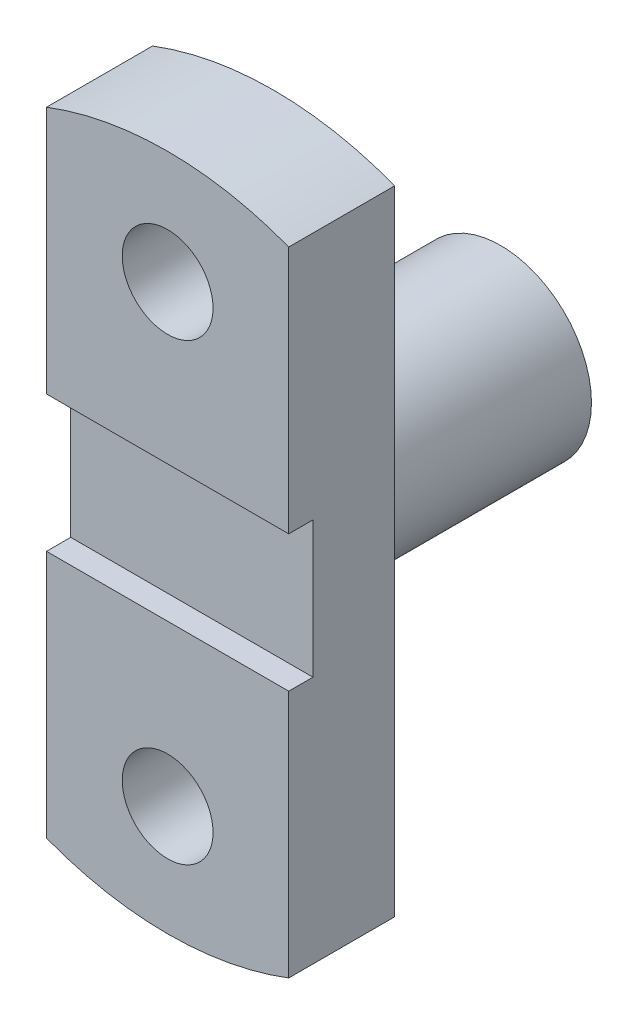
ISO-10303-21;
HEADER;
FILE_DESCRIPTION(('STEP AP214'),'2;1');
FILE_NAME('part.step','',(''),(''),'','','');
FILE_SCHEMA(('AUTOMOTIVE_DESIGN { 1 0 10303 214 1 1 1 1 }'));
ENDSEC;
DATA;
#1=APPLICATION_CONTEXT('core data for automotive mechanical design processes');
#2=APPLICATION_PROTOCOL_DEFINITION('international standard','automotive_design',2000,#1);
#3=PRODUCT_CONTEXT('',#1,'mechanical');
#4=PRODUCT('Part','Part','',(#3));
#5=PRODUCT_RELATED_PRODUCT_CATEGORY('part','',(#4));
#6=PRODUCT_DEFINITION_FORMATION('','',#4);
#7=PRODUCT_DEFINITION_CONTEXT('part definition',#1,'design');
#8=PRODUCT_DEFINITION('design','',#6,#7);
#9=PRODUCT_DEFINITION_SHAPE('','',#8);
#10=(LENGTH_UNIT() NAMED_UNIT(*) SI_UNIT(.MILLI.,.METRE.));
#11=(NAMED_UNIT(*) PLANE_ANGLE_UNIT() SI_UNIT($,.RADIAN.));
#12=(NAMED_UNIT(*) SI_UNIT($,.STERADIAN.) SOLID_ANGLE_UNIT());
#13=UNCERTAINTY_MEASURE_WITH_UNIT(LENGTH_MEASURE(1.E-05),#10,'distance_accuracy_value','');
#14=(GEOMETRIC_REPRESENTATION_CONTEXT(3) GLOBAL_UNCERTAINTY_ASSIGNED_CONTEXT((#13)) GLOBAL_UNIT_ASSIGNED_CONTEXT((#10,
#11,#12)) REPRESENTATION_CONTEXT('',''));
#15=CARTESIAN_POINT('',(0.,0.,0.));
#16=DIRECTION('',(0.,0.,1.));
#17=DIRECTION('',(1.,0.,0.));
#18=AXIS2_PLACEMENT_3D('',#15,#16,#17);
#19=CARTESIAN_POINT('',(0.,0.,35.));
#20=DIRECTION('',(0.,0.,1.));
#21=DIRECTION('',(1.,0.,0.));
#22=AXIS2_PLACEMENT_3D('',#19,#20,#21);
#23=PLANE('',#22);
#24=CARTESIAN_POINT('',(0.,74.5489272505211,35.));
#25=DIRECTION('',(0.,0.,1.));
#26=DIRECTION('',(1.,0.,0.));
#27=AXIS2_PLACEMENT_3D('',#24,#25,#26);
#28=CIRCLE('',#27,15.);
#29=CARTESIAN_POINT('',(15.,74.5489272505211,35.));
#30=VERTEX_POINT('',#29);
#31=EDGE_CURVE('E179',#30,#30,#28,.T.);
#32=ORIENTED_EDGE('',*,*,#31,.F.);
#33=EDGE_LOOP('',(#32));
#34=FACE_BOUND('',#33,.T.);
#35=DIRECTION('',(1.,0.,0.));
#36=VECTOR('',#35,1.);
#37=CARTESIAN_POINT('',(-40.,22.5,35.));
#38=LINE('',#37,#36);
#39=CARTESIAN_POINT('',(-40.,22.5,35.));
#40=VERTEX_POINT('',#39);
#41=CARTESIAN_POINT('',(40.,22.5,35.));
#42=VERTEX_POINT('',#41);
#43=EDGE_CURVE('E119',#40,#42,#38,.T.);
#44=ORIENTED_EDGE('',*,*,#43,.T.);
#45=DIRECTION('',(0.,1.,0.));
#46=VECTOR('',#45,1.);
#47=CARTESIAN_POINT('',(40.,104.548927250521,35.));
#48=LINE('',#47,#46);
#49=CARTESIAN_POINT('',(40.,104.548927250521,35.));
#50=VERTEX_POINT('',#49);
#51=EDGE_CURVE('E131',#42,#50,#48,.T.);
#52=ORIENTED_EDGE('',*,*,#51,.T.);
#53=CARTESIAN_POINT('',(0.,0.,35.));
#54=DIRECTION('',(0.,0.,1.));
#55=DIRECTION('',(1.,0.,0.));
#56=AXIS2_PLACEMENT_3D('',#53,#54,#55);
#57=CIRCLE('',#56,111.939618496914);
#58=CARTESIAN_POINT('',(-40.,104.548927250521,35.));
#59=VERTEX_POINT('',#58);
#60=EDGE_CURVE('E148',#50,#59,#57,.T.);
#61=ORIENTED_EDGE('',*,*,#60,.T.);
#62=DIRECTION('',(0.,-1.,0.));
#63=VECTOR('',#62,1.);
#64=CARTESIAN_POINT('',(-40.,-104.548927250521,35.));
#65=LINE('',#64,#63);
#66=EDGE_CURVE('E134',#59,#40,#65,.T.);
#67=ORIENTED_EDGE('',*,*,#66,.T.);
#68=EDGE_LOOP('',(#44,#52,#61,#67));
#69=FACE_BOUND('',#68,.T.);
#70=ADVANCED_FACE('F39',(#34,#69),#23,.T.);
#71=CARTESIAN_POINT('',(0.,0.,35.));
#72=DIRECTION('',(0.,0.,-1.));
#73=DIRECTION('',(-1.,0.,0.));
#74=AXIS2_PLACEMENT_3D('',#71,#72,#73);
#75=CYLINDRICAL_SURFACE('',#74,111.939618496914);
#76=CARTESIAN_POINT('',(0.,0.,0.));
#77=DIRECTION('',(0.,0.,1.));
#78=DIRECTION('',(1.,0.,0.));
#79=AXIS2_PLACEMENT_3D('',#76,#77,#78);
#80=CIRCLE('',#79,111.939618496914);
#81=CARTESIAN_POINT('',(-40.,-104.548927250521,0.));
#82=VERTEX_POINT('',#81);
#83=CARTESIAN_POINT('',(40.,-104.548927250521,0.));
#84=VERTEX_POINT('',#83);
#85=EDGE_CURVE('E156',#82,#84,#80,.T.);
#86=ORIENTED_EDGE('',*,*,#85,.T.);
#87=DIRECTION('',(0.,0.,-1.));
#88=VECTOR('',#87,1.);
#89=CARTESIAN_POINT('',(40.,-104.548927250521,35.));
#90=LINE('',#89,#88);
#91=CARTESIAN_POINT('',(40.,-104.548927250521,35.));
#92=VERTEX_POINT('',#91);
#93=EDGE_CURVE('E48',#92,#84,#90,.T.);
#94=ORIENTED_EDGE('',*,*,#93,.F.);
#95=CARTESIAN_POINT('',(0.,0.,35.));
#96=DIRECTION('',(0.,0.,1.));
#97=DIRECTION('',(1.,0.,0.));
#98=AXIS2_PLACEMENT_3D('',#95,#96,#97);
#99=CIRCLE('',#98,111.939618496914);
#100=CARTESIAN_POINT('',(-40.,-104.548927250521,35.));
#101=VERTEX_POINT('',#100);
#102=EDGE_CURVE('E144',#101,#92,#99,.T.);
#103=ORIENTED_EDGE('',*,*,#102,.F.);
#104=DIRECTION('',(0.,0.,-1.));
#105=VECTOR('',#104,1.);
#106=CARTESIAN_POINT('',(-40.,-104.548927250521,35.));
#107=LINE('',#106,#105);
#108=EDGE_CURVE('E155',#101,#82,#107,.T.);
#109=ORIENTED_EDGE('',*,*,#108,.T.);
#110=EDGE_LOOP('',(#86,#94,#103,#109));
#111=FACE_BOUND('',#110,.T.);
#112=ADVANCED_FACE('F41',(#111),#75,.T.);
#113=CARTESIAN_POINT('',(40.,104.548927250521,35.));
#114=DIRECTION('',(-1.,0.,0.));
#115=DIRECTION('',(0.,0.,1.));
#116=AXIS2_PLACEMENT_3D('',#113,#114,#115);
#117=PLANE('',#116);
#118=ORIENTED_EDGE('',*,*,#51,.F.);
#119=DIRECTION('',(0.,0.,1.));
#120=VECTOR('',#119,1.);
#121=CARTESIAN_POINT('',(40.,22.5,35.));
#122=LINE('',#121,#120);
#123=CARTESIAN_POINT('',(40.,22.5,27.));
#124=VERTEX_POINT('',#123);
#125=EDGE_CURVE('E115',#124,#42,#122,.T.);
#126=ORIENTED_EDGE('',*,*,#125,.F.);
#127=DIRECTION('',(0.,1.,0.));
#128=VECTOR('',#127,1.);
#129=CARTESIAN_POINT('',(40.,22.5,27.));
#130=LINE('',#129,#128);
#131=CARTESIAN_POINT('',(40.,-22.5,27.));
#132=VERTEX_POINT('',#131);
#133=EDGE_CURVE('E202',#132,#124,#130,.T.);
#134=ORIENTED_EDGE('',*,*,#133,.F.);
#135=DIRECTION('',(0.,0.,-1.));
#136=VECTOR('',#135,1.);
#137=CARTESIAN_POINT('',(40.,-22.5,27.));
#138=LINE('',#137,#136);
#139=CARTESIAN_POINT('',(40.,-22.5,35.));
#140=VERTEX_POINT('',#139);
#141=EDGE_CURVE('E126',#140,#132,#138,.T.);
#142=ORIENTED_EDGE('',*,*,#141,.F.);
#143=EDGE_CURVE('E93',#92,#140,#48,.T.);
#144=ORIENTED_EDGE('',*,*,#143,.F.);
#145=ORIENTED_EDGE('',*,*,#93,.T.);
#146=DIRECTION('',(0.,1.,0.));
#147=VECTOR('',#146,1.);
#148=CARTESIAN_POINT('',(40.,104.548927250521,0.));
#149=LINE('',#148,#147);
#150=CARTESIAN_POINT('',(40.,104.548927250521,0.));
#151=VERTEX_POINT('',#150);
#152=EDGE_CURVE('E160',#84,#151,#149,.T.);
#153=ORIENTED_EDGE('',*,*,#152,.T.);
#154=DIRECTION('',(0.,0.,-1.));
#155=VECTOR('',#154,1.);
#156=CARTESIAN_POINT('',(40.,104.548927250521,35.));
#157=LINE('',#156,#155);
#158=EDGE_CURVE('E141',#50,#151,#157,.T.);
#159=ORIENTED_EDGE('',*,*,#158,.F.);
#160=EDGE_LOOP('',(#118,#126,#134,#142,#144,#145,#153,#159));
#161=FACE_BOUND('',#160,.T.);
#162=ADVANCED_FACE('F139',(#161),#117,.F.);
#163=CARTESIAN_POINT('',(0.,0.,35.));
#164=DIRECTION('',(0.,0.,-1.));
#165=DIRECTION('',(-1.,0.,0.));
#166=AXIS2_PLACEMENT_3D('',#163,#164,#165);
#167=CYLINDRICAL_SURFACE('',#166,111.939618496914);
#168=CARTESIAN_POINT('',(0.,0.,0.));
#169=DIRECTION('',(0.,0.,1.));
#170=DIRECTION('',(1.,0.,0.));
#171=AXIS2_PLACEMENT_3D('',#168,#169,#170);
#172=CIRCLE('',#171,111.939618496914);
#173=CARTESIAN_POINT('',(-40.,104.548927250521,0.));
#174=VERTEX_POINT('',#173);
#175=EDGE_CURVE('E163',#151,#174,#172,.T.);
#176=ORIENTED_EDGE('',*,*,#175,.T.);
#177=DIRECTION('',(0.,0.,-1.));
#178=VECTOR('',#177,1.);
#179=CARTESIAN_POINT('',(-40.,104.548927250521,35.));
#180=LINE('',#179,#178);
#181=EDGE_CURVE('E170',#59,#174,#180,.T.);
#182=ORIENTED_EDGE('',*,*,#181,.F.);
#183=ORIENTED_EDGE('',*,*,#60,.F.);
#184=ORIENTED_EDGE('',*,*,#158,.T.);
#185=EDGE_LOOP('',(#176,#182,#183,#184));
#186=FACE_BOUND('',#185,.T.);
#187=ADVANCED_FACE('F228',(#186),#167,.T.);
#188=CARTESIAN_POINT('',(-40.,-104.548927250521,35.));
#189=DIRECTION('',(1.,0.,0.));
#190=DIRECTION('',(0.,0.,-1.));
#191=AXIS2_PLACEMENT_3D('',#188,#189,#190);
#192=PLANE('',#191);
#193=DIRECTION('',(0.,1.,0.));
#194=VECTOR('',#193,1.);
#195=CARTESIAN_POINT('',(-40.,22.5,27.));
#196=LINE('',#195,#194);
#197=CARTESIAN_POINT('',(-40.,-22.5,27.));
#198=VERTEX_POINT('',#197);
#199=CARTESIAN_POINT('',(-40.,22.5,27.));
#200=VERTEX_POINT('',#199);
#201=EDGE_CURVE('E137',#198,#200,#196,.T.);
#202=ORIENTED_EDGE('',*,*,#201,.T.);
#203=DIRECTION('',(0.,0.,1.));
#204=VECTOR('',#203,1.);
#205=CARTESIAN_POINT('',(-40.,22.5,35.));
#206=LINE('',#205,#204);
#207=EDGE_CURVE('E205',#200,#40,#206,.T.);
#208=ORIENTED_EDGE('',*,*,#207,.T.);
#209=ORIENTED_EDGE('',*,*,#66,.F.);
#210=ORIENTED_EDGE('',*,*,#181,.T.);
#211=DIRECTION('',(0.,-1.,0.));
#212=VECTOR('',#211,1.);
#213=CARTESIAN_POINT('',(-40.,-104.548927250521,0.));
#214=LINE('',#213,#212);
#215=EDGE_CURVE('E85',#174,#82,#214,.T.);
#216=ORIENTED_EDGE('',*,*,#215,.T.);
#217=ORIENTED_EDGE('',*,*,#108,.F.);
#218=CARTESIAN_POINT('',(-40.,-22.5,35.));
#219=VERTEX_POINT('',#218);
#220=EDGE_CURVE('E63',#219,#101,#65,.T.);
#221=ORIENTED_EDGE('',*,*,#220,.F.);
#222=DIRECTION('',(0.,0.,-1.));
#223=VECTOR('',#222,1.);
#224=CARTESIAN_POINT('',(-40.,-22.5,27.));
#225=LINE('',#224,#223);
#226=EDGE_CURVE('E55',#219,#198,#225,.T.);
#227=ORIENTED_EDGE('',*,*,#226,.T.);
#228=EDGE_LOOP('',(#202,#208,#209,#210,#216,#217,#221,#227));
#229=FACE_BOUND('',#228,.T.);
#230=ADVANCED_FACE('F242',(#229),#192,.F.);
#231=CARTESIAN_POINT('',(0.,-75.4510727494789,35.));
#232=DIRECTION('',(0.,0.,1.));
#233=DIRECTION('',(1.,0.,0.));
#234=AXIS2_PLACEMENT_3D('',#231,#232,#233);
#235=CIRCLE('',#234,15.);
#236=CARTESIAN_POINT('',(15.,-75.4510727494789,35.));
#237=VERTEX_POINT('',#236);
#238=EDGE_CURVE('E183',#237,#237,#235,.T.);
#239=ORIENTED_EDGE('',*,*,#238,.F.);
#240=EDGE_LOOP('',(#239));
#241=FACE_BOUND('',#240,.T.);
#242=DIRECTION('',(1.,0.,0.));
#243=VECTOR('',#242,1.);
#244=CARTESIAN_POINT('',(-40.,-22.5,35.));
#245=LINE('',#244,#243);
#246=EDGE_CURVE('E136',#219,#140,#245,.T.);
#247=ORIENTED_EDGE('',*,*,#246,.F.);
#248=ORIENTED_EDGE('',*,*,#220,.T.);
#249=ORIENTED_EDGE('',*,*,#102,.T.);
#250=ORIENTED_EDGE('',*,*,#143,.T.);
#251=EDGE_LOOP('',(#247,#248,#249,#250));
#252=FACE_BOUND('',#251,.T.);
#253=ADVANCED_FACE('F220',(#241,#252),#23,.T.);
#254=CARTESIAN_POINT('',(0.,0.,0.));
#255=DIRECTION('',(0.,0.,1.));
#256=DIRECTION('',(1.,0.,0.));
#257=AXIS2_PLACEMENT_3D('',#254,#255,#256);
#258=PLANE('',#257);
#259=CARTESIAN_POINT('',(0.,0.,0.));
#260=DIRECTION('',(0.,0.,1.));
#261=DIRECTION('',(1.,0.,0.));
#262=AXIS2_PLACEMENT_3D('',#259,#260,#261);
#263=CIRCLE('',#262,30.);
#264=CARTESIAN_POINT('',(30.,0.,0.));
#265=VERTEX_POINT('',#264);
#266=EDGE_CURVE('E11',#265,#265,#263,.F.);
#267=ORIENTED_EDGE('',*,*,#266,.F.);
#268=EDGE_LOOP('',(#267));
#269=FACE_BOUND('',#268,.T.);
#270=CARTESIAN_POINT('',(0.,-75.4510727494789,0.));
#271=DIRECTION('',(0.,0.,1.));
#272=DIRECTION('',(1.,0.,0.));
#273=AXIS2_PLACEMENT_3D('',#270,#271,#272);
#274=CIRCLE('',#273,15.);
#275=CARTESIAN_POINT('',(15.,-75.4510727494789,0.));
#276=VERTEX_POINT('',#275);
#277=EDGE_CURVE('E180',#276,#276,#274,.T.);
#278=ORIENTED_EDGE('',*,*,#277,.T.);
#279=EDGE_LOOP('',(#278));
#280=FACE_BOUND('',#279,.T.);
#281=CARTESIAN_POINT('',(0.,74.5489272505211,0.));
#282=DIRECTION('',(0.,0.,1.));
#283=DIRECTION('',(1.,0.,0.));
#284=AXIS2_PLACEMENT_3D('',#281,#282,#283);
#285=CIRCLE('',#284,15.);
#286=CARTESIAN_POINT('',(15.,74.5489272505211,0.));
#287=VERTEX_POINT('',#286);
#288=EDGE_CURVE('E127',#287,#287,#285,.T.);
#289=ORIENTED_EDGE('',*,*,#288,.T.);
#290=EDGE_LOOP('',(#289));
#291=FACE_BOUND('',#290,.T.);
#292=ORIENTED_EDGE('',*,*,#85,.F.);
#293=ORIENTED_EDGE('',*,*,#215,.F.);
#294=ORIENTED_EDGE('',*,*,#175,.F.);
#295=ORIENTED_EDGE('',*,*,#152,.F.);
#296=EDGE_LOOP('',(#292,#293,#294,#295));
#297=FACE_BOUND('',#296,.T.);
#298=ADVANCED_FACE('F230',(#269,#280,#291,#297),#258,.F.);
#299=CARTESIAN_POINT('',(-40.,22.5,35.));
#300=DIRECTION('',(0.,1.,0.));
#301=DIRECTION('',(0.,0.,1.));
#302=AXIS2_PLACEMENT_3D('',#299,#300,#301);
#303=PLANE('',#302);
#304=ORIENTED_EDGE('',*,*,#43,.F.);
#305=ORIENTED_EDGE('',*,*,#207,.F.);
#306=DIRECTION('',(1.,0.,0.));
#307=VECTOR('',#306,1.);
#308=CARTESIAN_POINT('',(-40.,22.5,27.));
#309=LINE('',#308,#307);
#310=EDGE_CURVE('E121',#200,#124,#309,.T.);
#311=ORIENTED_EDGE('',*,*,#310,.T.);
#312=ORIENTED_EDGE('',*,*,#125,.T.);
#313=EDGE_LOOP('',(#304,#305,#311,#312));
#314=FACE_BOUND('',#313,.T.);
#315=ADVANCED_FACE('F117',(#314),#303,.F.);
#316=CARTESIAN_POINT('',(-40.,22.5,27.));
#317=DIRECTION('',(0.,0.,-1.));
#318=DIRECTION('',(0.,1.,0.));
#319=AXIS2_PLACEMENT_3D('',#316,#317,#318);
#320=PLANE('',#319);
#321=ORIENTED_EDGE('',*,*,#310,.F.);
#322=ORIENTED_EDGE('',*,*,#201,.F.);
#323=DIRECTION('',(1.,0.,0.));
#324=VECTOR('',#323,1.);
#325=CARTESIAN_POINT('',(-40.,-22.5,27.));
#326=LINE('',#325,#324);
#327=EDGE_CURVE('E215',#198,#132,#326,.T.);
#328=ORIENTED_EDGE('',*,*,#327,.T.);
#329=ORIENTED_EDGE('',*,*,#133,.T.);
#330=EDGE_LOOP('',(#321,#322,#328,#329));
#331=FACE_BOUND('',#330,.T.);
#332=ADVANCED_FACE('F239',(#331),#320,.F.);
#333=CARTESIAN_POINT('',(-40.,-22.5,27.));
#334=DIRECTION('',(0.,-1.,0.));
#335=DIRECTION('',(0.,0.,-1.));
#336=AXIS2_PLACEMENT_3D('',#333,#334,#335);
#337=PLANE('',#336);
#338=ORIENTED_EDGE('',*,*,#327,.F.);
#339=ORIENTED_EDGE('',*,*,#226,.F.);
#340=ORIENTED_EDGE('',*,*,#246,.T.);
#341=ORIENTED_EDGE('',*,*,#141,.T.);
#342=EDGE_LOOP('',(#338,#339,#340,#341));
#343=FACE_BOUND('',#342,.T.);
#344=ADVANCED_FACE('F219',(#343),#337,.F.);
#345=CARTESIAN_POINT('',(0.,74.5489272505211,-1.2E-05));
#346=DIRECTION('',(0.,0.,1.));
#347=DIRECTION('',(1.,0.,0.));
#348=AXIS2_PLACEMENT_3D('',#345,#346,#347);
#349=CYLINDRICAL_SURFACE('',#348,15.);
#350=CARTESIAN_POINT('',(15.,74.5489272505211,35.));
#351=CARTESIAN_POINT('',(15.,74.5489272505211,34.6354166666667));
#352=CARTESIAN_POINT('',(15.,74.5489272505211,34.2708333333333));
#353=CARTESIAN_POINT('',(15.,74.5489272505211,33.5416666666667));
#354=CARTESIAN_POINT('',(15.,74.5489272505211,33.1770833333333));
#355=CARTESIAN_POINT('',(15.,74.5489272505211,32.4479166666667));
#356=CARTESIAN_POINT('',(15.,74.5489272505211,32.0833333333333));
#357=CARTESIAN_POINT('',(15.,74.5489272505211,31.3541666666667));
#358=CARTESIAN_POINT('',(15.,74.5489272505211,30.9895833333333));
#359=CARTESIAN_POINT('',(15.,74.5489272505211,30.2604166666667));
#360=CARTESIAN_POINT('',(15.,74.5489272505211,29.8958333333333));
#361=CARTESIAN_POINT('',(15.,74.5489272505211,29.1666666666667));
#362=CARTESIAN_POINT('',(15.,74.5489272505211,28.8020833333333));
#363=CARTESIAN_POINT('',(15.,74.5489272505211,28.0729166666667));
#364=CARTESIAN_POINT('',(15.,74.5489272505211,27.7083333333333));
#365=CARTESIAN_POINT('',(15.,74.5489272505211,26.9791666666667));
#366=CARTESIAN_POINT('',(15.,74.5489272505211,26.6145833333333));
#367=CARTESIAN_POINT('',(15.,74.5489272505211,25.8854166666667));
#368=CARTESIAN_POINT('',(15.,74.5489272505211,25.5208333333333));
#369=CARTESIAN_POINT('',(15.,74.5489272505211,24.7916666666667));
#370=CARTESIAN_POINT('',(15.,74.5489272505211,24.4270833333333));
#371=CARTESIAN_POINT('',(15.,74.5489272505211,23.6979166666667));
#372=CARTESIAN_POINT('',(15.,74.5489272505211,23.3333333333333));
#373=CARTESIAN_POINT('',(15.,74.5489272505211,22.6041666666667));
#374=CARTESIAN_POINT('',(15.,74.5489272505211,22.2395833333333));
#375=CARTESIAN_POINT('',(15.,74.5489272505211,21.5104166666667));
#376=CARTESIAN_POINT('',(15.,74.5489272505211,21.1458333333333));
#377=CARTESIAN_POINT('',(15.,74.5489272505211,20.4166666666667));
#378=CARTESIAN_POINT('',(15.,74.5489272505211,20.0520833333333));
#379=CARTESIAN_POINT('',(15.,74.5489272505211,19.3229166666667));
#380=CARTESIAN_POINT('',(15.,74.5489272505211,18.9583333333333));
#381=CARTESIAN_POINT('',(15.,74.5489272505211,18.2291666666667));
#382=CARTESIAN_POINT('',(15.,74.5489272505211,17.8645833333333));
#383=CARTESIAN_POINT('',(15.,74.5489272505211,17.1354166666667));
#384=CARTESIAN_POINT('',(15.,74.5489272505211,16.7708333333333));
#385=CARTESIAN_POINT('',(15.,74.5489272505211,16.0416666666667));
#386=CARTESIAN_POINT('',(15.,74.5489272505211,15.6770833333333));
#387=CARTESIAN_POINT('',(15.,74.5489272505211,14.9479166666667));
#388=CARTESIAN_POINT('',(15.,74.5489272505211,14.5833333333333));
#389=CARTESIAN_POINT('',(15.,74.5489272505211,13.8541666666667));
#390=CARTESIAN_POINT('',(15.,74.5489272505211,13.4895833333333));
#391=CARTESIAN_POINT('',(15.,74.5489272505211,12.7604166666667));
#392=CARTESIAN_POINT('',(15.,74.5489272505211,12.3958333333333));
#393=CARTESIAN_POINT('',(15.,74.5489272505211,11.6666666666667));
#394=CARTESIAN_POINT('',(15.,74.5489272505211,11.3020833333333));
#395=CARTESIAN_POINT('',(15.,74.5489272505211,10.5729166666667));
#396=CARTESIAN_POINT('',(15.,74.5489272505211,10.2083333333333));
#397=CARTESIAN_POINT('',(15.,74.5489272505211,9.47916666666667));
#398=CARTESIAN_POINT('',(15.,74.5489272505211,9.11458333333333));
#399=CARTESIAN_POINT('',(15.,74.5489272505211,8.38541666666667));
#400=CARTESIAN_POINT('',(15.,74.5489272505211,8.02083333333333));
#401=CARTESIAN_POINT('',(15.,74.5489272505211,7.29166666666667));
#402=CARTESIAN_POINT('',(15.,74.5489272505211,6.92708333333334));
#403=CARTESIAN_POINT('',(15.,74.5489272505211,6.19791666666667));
#404=CARTESIAN_POINT('',(15.,74.5489272505211,5.83333333333334));
#405=CARTESIAN_POINT('',(15.,74.5489272505211,5.10416666666667));
#406=CARTESIAN_POINT('',(15.,74.5489272505211,4.73958333333333));
#407=CARTESIAN_POINT('',(15.,74.5489272505211,4.01041666666667));
#408=CARTESIAN_POINT('',(15.,74.5489272505211,3.64583333333333));
#409=CARTESIAN_POINT('',(15.,74.5489272505211,2.91666666666667));
#410=CARTESIAN_POINT('',(15.,74.5489272505211,2.55208333333333));
#411=CARTESIAN_POINT('',(15.,74.5489272505211,1.82291666666667));
#412=CARTESIAN_POINT('',(15.,74.5489272505211,1.45833333333333));
#413=CARTESIAN_POINT('',(15.,74.5489272505211,0.729166666666666));
#414=CARTESIAN_POINT('',(15.,74.5489272505211,0.364583333333334));
#415=CARTESIAN_POINT('',(15.,74.5489272505211,0.));
#416=B_SPLINE_CURVE_WITH_KNOTS('',3,(#350,#351,#352,#353,#354,#355,#356,#357,#358,#359,#360,
#361,#362,#363,#364,#365,#366,#367,#368,#369,#370,#371,#372,#373,#374,#375,#376,#377,#378,#379,
#380,#381,#382,#383,#384,#385,#386,#387,#388,#389,#390,#391,#392,#393,#394,#395,#396,#397,#398,
#399,#400,#401,#402,#403,#404,#405,#406,#407,#408,#409,#410,#411,#412,#413,#414,#415),
.UNSPECIFIED.,.F.,.F.,(4,2,2,2,2,2,2,2,2,2,2,2,2,2,2,2,2,2,2,2,2,2,2,2,2,2,2,2,2,2,2,2,4),(0.,
1.09375,2.1875,3.28125,4.375,5.46875,6.5625,7.65625,8.75,9.84375,10.9375,12.03125,13.125,
14.21875,15.3125,16.40625,17.5,18.59375,19.6875,20.78125,21.875,22.96875,24.0625,25.15625,26.25,
27.34375,28.4375,29.53125,30.625,31.71875,32.8125,33.90625,35.),.UNSPECIFIED.);
#417=EDGE_CURVE('BSEAM256',#30,#287,#416,.T.);
#418=ORIENTED_EDGE('',*,*,#31,.T.);
#419=ORIENTED_EDGE('',*,*,#288,.F.);
#420=ORIENTED_EDGE('',*,*,#417,.T.);
#421=ORIENTED_EDGE('',*,*,#417,.F.);
#422=EDGE_LOOP('',(#418,#420,#419,#421));
#423=FACE_BOUND('',#422,.T.);
#424=ADVANCED_FACE('F256',(#423),#349,.F.);
#425=CARTESIAN_POINT('',(0.,-75.4510727494789,-1.2E-05));
#426=DIRECTION('',(0.,0.,1.));
#427=DIRECTION('',(1.,0.,0.));
#428=AXIS2_PLACEMENT_3D('',#425,#426,#427);
#429=CYLINDRICAL_SURFACE('',#428,15.);
#430=CARTESIAN_POINT('',(15.,-75.4510727494789,35.));
#431=CARTESIAN_POINT('',(15.,-75.4510727494789,34.6354166666667));
#432=CARTESIAN_POINT('',(15.,-75.4510727494789,34.2708333333333));
#433=CARTESIAN_POINT('',(15.,-75.4510727494789,33.5416666666667));
#434=CARTESIAN_POINT('',(15.,-75.4510727494789,33.1770833333333));
#435=CARTESIAN_POINT('',(15.,-75.4510727494789,32.4479166666667));
#436=CARTESIAN_POINT('',(15.,-75.4510727494789,32.0833333333333));
#437=CARTESIAN_POINT('',(15.,-75.4510727494789,31.3541666666667));
#438=CARTESIAN_POINT('',(15.,-75.4510727494789,30.9895833333333));
#439=CARTESIAN_POINT('',(15.,-75.4510727494789,30.2604166666667));
#440=CARTESIAN_POINT('',(15.,-75.4510727494789,29.8958333333333));
#441=CARTESIAN_POINT('',(15.,-75.4510727494789,29.1666666666667));
#442=CARTESIAN_POINT('',(15.,-75.4510727494789,28.8020833333333));
#443=CARTESIAN_POINT('',(15.,-75.4510727494789,28.0729166666667));
#444=CARTESIAN_POINT('',(15.,-75.4510727494789,27.7083333333333));
#445=CARTESIAN_POINT('',(15.,-75.4510727494789,26.9791666666667));
#446=CARTESIAN_POINT('',(15.,-75.4510727494789,26.6145833333333));
#447=CARTESIAN_POINT('',(15.,-75.4510727494789,25.8854166666667));
#448=CARTESIAN_POINT('',(15.,-75.4510727494789,25.5208333333333));
#449=CARTESIAN_POINT('',(15.,-75.4510727494789,24.7916666666667));
#450=CARTESIAN_POINT('',(15.,-75.4510727494789,24.4270833333333));
#451=CARTESIAN_POINT('',(15.,-75.4510727494789,23.6979166666667));
#452=CARTESIAN_POINT('',(15.,-75.4510727494789,23.3333333333333));
#453=CARTESIAN_POINT('',(15.,-75.4510727494789,22.6041666666667));
#454=CARTESIAN_POINT('',(15.,-75.4510727494789,22.2395833333333));
#455=CARTESIAN_POINT('',(15.,-75.4510727494789,21.5104166666667));
#456=CARTESIAN_POINT('',(15.,-75.4510727494789,21.1458333333333));
#457=CARTESIAN_POINT('',(15.,-75.4510727494789,20.4166666666667));
#458=CARTESIAN_POINT('',(15.,-75.4510727494789,20.0520833333333));
#459=CARTESIAN_POINT('',(15.,-75.4510727494789,19.3229166666667));
#460=CARTESIAN_POINT('',(15.,-75.4510727494789,18.9583333333333));
#461=CARTESIAN_POINT('',(15.,-75.4510727494789,18.2291666666667));
#462=CARTESIAN_POINT('',(15.,-75.4510727494789,17.8645833333333));
#463=CARTESIAN_POINT('',(15.,-75.4510727494789,17.1354166666667));
#464=CARTESIAN_POINT('',(15.,-75.4510727494789,16.7708333333333));
#465=CARTESIAN_POINT('',(15.,-75.4510727494789,16.0416666666667));
#466=CARTESIAN_POINT('',(15.,-75.4510727494789,15.6770833333333));
#467=CARTESIAN_POINT('',(15.,-75.4510727494789,14.9479166666667));
#468=CARTESIAN_POINT('',(15.,-75.4510727494789,14.5833333333333));
#469=CARTESIAN_POINT('',(15.,-75.4510727494789,13.8541666666667));
#470=CARTESIAN_POINT('',(15.,-75.4510727494789,13.4895833333333));
#471=CARTESIAN_POINT('',(15.,-75.4510727494789,12.7604166666667));
#472=CARTESIAN_POINT('',(15.,-75.4510727494789,12.3958333333333));
#473=CARTESIAN_POINT('',(15.,-75.4510727494789,11.6666666666667));
#474=CARTESIAN_POINT('',(15.,-75.4510727494789,11.3020833333333));
#475=CARTESIAN_POINT('',(15.,-75.4510727494789,10.5729166666667));
#476=CARTESIAN_POINT('',(15.,-75.4510727494789,10.2083333333333));
#477=CARTESIAN_POINT('',(15.,-75.4510727494789,9.47916666666667));
#478=CARTESIAN_POINT('',(15.,-75.4510727494789,9.11458333333333));
#479=CARTESIAN_POINT('',(15.,-75.4510727494789,8.38541666666667));
#480=CARTESIAN_POINT('',(15.,-75.4510727494789,8.02083333333333));
#481=CARTESIAN_POINT('',(15.,-75.4510727494789,7.29166666666667));
#482=CARTESIAN_POINT('',(15.,-75.4510727494789,6.92708333333334));
#483=CARTESIAN_POINT('',(15.,-75.4510727494789,6.19791666666667));
#484=CARTESIAN_POINT('',(15.,-75.4510727494789,5.83333333333334));
#485=CARTESIAN_POINT('',(15.,-75.4510727494789,5.10416666666667));
#486=CARTESIAN_POINT('',(15.,-75.4510727494789,4.73958333333333));
#487=CARTESIAN_POINT('',(15.,-75.4510727494789,4.01041666666667));
#488=CARTESIAN_POINT('',(15.,-75.4510727494789,3.64583333333333));
#489=CARTESIAN_POINT('',(15.,-75.4510727494789,2.91666666666667));
#490=CARTESIAN_POINT('',(15.,-75.4510727494789,2.55208333333333));
#491=CARTESIAN_POINT('',(15.,-75.4510727494789,1.82291666666667));
#492=CARTESIAN_POINT('',(15.,-75.4510727494789,1.45833333333333));
#493=CARTESIAN_POINT('',(15.,-75.4510727494789,0.729166666666666));
#494=CARTESIAN_POINT('',(15.,-75.4510727494789,0.364583333333334));
#495=CARTESIAN_POINT('',(15.,-75.4510727494789,0.));
#496=B_SPLINE_CURVE_WITH_KNOTS('',3,(#430,#431,#432,#433,#434,#435,#436,#437,#438,#439,#440,
#441,#442,#443,#444,#445,#446,#447,#448,#449,#450,#451,#452,#453,#454,#455,#456,#457,#458,#459,
#460,#461,#462,#463,#464,#465,#466,#467,#468,#469,#470,#471,#472,#473,#474,#475,#476,#477,#478,
#479,#480,#481,#482,#483,#484,#485,#486,#487,#488,#489,#490,#491,#492,#493,#494,#495),
.UNSPECIFIED.,.F.,.F.,(4,2,2,2,2,2,2,2,2,2,2,2,2,2,2,2,2,2,2,2,2,2,2,2,2,2,2,2,2,2,2,2,4),(0.,
1.09375,2.1875,3.28125,4.375,5.46875,6.5625,7.65625,8.75,9.84375,10.9375,12.03125,13.125,
14.21875,15.3125,16.40625,17.5,18.59375,19.6875,20.78125,21.875,22.96875,24.0625,25.15625,26.25,
27.34375,28.4375,29.53125,30.625,31.71875,32.8125,33.90625,35.),.UNSPECIFIED.);
#497=EDGE_CURVE('BSEAM262',#237,#276,#496,.T.);
#498=ORIENTED_EDGE('',*,*,#238,.T.);
#499=ORIENTED_EDGE('',*,*,#277,.F.);
#500=ORIENTED_EDGE('',*,*,#497,.T.);
#501=ORIENTED_EDGE('',*,*,#497,.F.);
#502=EDGE_LOOP('',(#498,#500,#499,#501));
#503=FACE_BOUND('',#502,.T.);
#504=ADVANCED_FACE('F262',(#503),#429,.F.);
#505=CARTESIAN_POINT('',(0.,0.,-75.));
#506=DIRECTION('',(0.,0.,1.));
#507=DIRECTION('',(1.,0.,0.));
#508=AXIS2_PLACEMENT_3D('',#505,#506,#507);
#509=CYLINDRICAL_SURFACE('',#508,30.);
#510=CARTESIAN_POINT('',(0.,0.,-75.));
#511=DIRECTION('',(0.,0.,-1.));
#512=DIRECTION('',(-1.,0.,0.));
#513=AXIS2_PLACEMENT_3D('',#510,#511,#512);
#514=CIRCLE('',#513,30.);
#515=CARTESIAN_POINT('',(-30.,0.,-75.));
#516=VERTEX_POINT('',#515);
#517=EDGE_CURVE('E191',#516,#516,#514,.T.);
#518=ORIENTED_EDGE('',*,*,#517,.F.);
#519=EDGE_LOOP('',(#518));
#520=FACE_BOUND('',#519,.T.);
#521=ORIENTED_EDGE('',*,*,#266,.T.);
#522=EDGE_LOOP('',(#521));
#523=FACE_BOUND('',#522,.T.);
#524=ADVANCED_FACE('F266',(#520,#523),#509,.T.);
#525=CARTESIAN_POINT('',(0.,0.,-75.));
#526=DIRECTION('',(0.,0.,-1.));
#527=DIRECTION('',(-1.,0.,0.));
#528=AXIS2_PLACEMENT_3D('',#525,#526,#527);
#529=PLANE('',#528);
#530=ORIENTED_EDGE('',*,*,#517,.T.);
#531=EDGE_LOOP('',(#530));
#532=FACE_BOUND('',#531,.T.);
#533=ADVANCED_FACE('F269',(#532),#529,.T.);
#534=CLOSED_SHELL('',(#70,#112,#162,#187,#230,#253,#298,#315,#332,#344,#424,#504,#524,#533));
#535=MANIFOLD_SOLID_BREP('B2',#534);
#536=ADVANCED_BREP_SHAPE_REPRESENTATION('',(#18,#535),#14);
#537=SHAPE_DEFINITION_REPRESENTATION(#9,#536);
ENDSEC;
END-ISO-10303-21;
